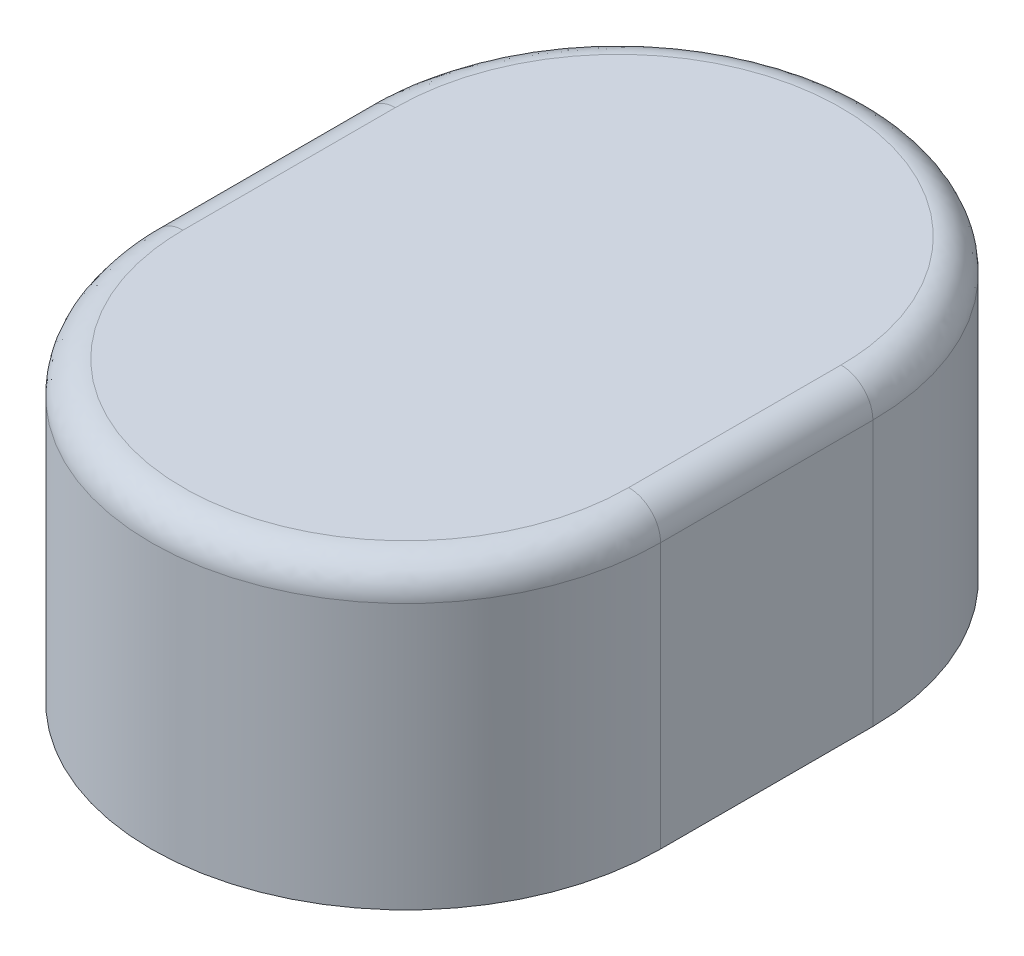
ISO-10303-21;
HEADER;
FILE_DESCRIPTION(('STEP AP214'),'2;1');
FILE_NAME('part.step','',(''),(''),'','','');
FILE_SCHEMA(('AUTOMOTIVE_DESIGN { 1 0 10303 214 1 1 1 1 }'));
ENDSEC;
DATA;
#1=APPLICATION_CONTEXT('core data for automotive mechanical design processes');
#2=APPLICATION_PROTOCOL_DEFINITION('international standard','automotive_design',2000,#1);
#3=PRODUCT_CONTEXT('',#1,'mechanical');
#4=PRODUCT('Part','Part','',(#3));
#5=PRODUCT_RELATED_PRODUCT_CATEGORY('part','',(#4));
#6=PRODUCT_DEFINITION_FORMATION('','',#4);
#7=PRODUCT_DEFINITION_CONTEXT('part definition',#1,'design');
#8=PRODUCT_DEFINITION('design','',#6,#7);
#9=PRODUCT_DEFINITION_SHAPE('','',#8);
#10=(LENGTH_UNIT() NAMED_UNIT(*) SI_UNIT(.MILLI.,.METRE.));
#11=(NAMED_UNIT(*) PLANE_ANGLE_UNIT() SI_UNIT($,.RADIAN.));
#12=(NAMED_UNIT(*) SI_UNIT($,.STERADIAN.) SOLID_ANGLE_UNIT());
#13=UNCERTAINTY_MEASURE_WITH_UNIT(LENGTH_MEASURE(1.E-05),#10,'distance_accuracy_value','');
#14=(GEOMETRIC_REPRESENTATION_CONTEXT(3) GLOBAL_UNCERTAINTY_ASSIGNED_CONTEXT((#13)) GLOBAL_UNIT_ASSIGNED_CONTEXT((#10,
#11,#12)) REPRESENTATION_CONTEXT('',''));
#15=CARTESIAN_POINT('',(0.,0.,0.));
#16=DIRECTION('',(0.,0.,1.));
#17=DIRECTION('',(1.,0.,0.));
#18=AXIS2_PLACEMENT_3D('',#15,#16,#17);
#19=CARTESIAN_POINT('',(-10.5,4.805,-0.25));
#20=DIRECTION('',(0.,-1.,0.));
#21=DIRECTION('',(0.,0.,-1.));
#22=AXIS2_PLACEMENT_3D('',#19,#20,#21);
#23=CYLINDRICAL_SURFACE('',#22,0.6);
#24=CARTESIAN_POINT('',(-10.5,4.73,-0.25));
#25=DIRECTION('',(0.,-1.,0.));
#26=DIRECTION('',(0.,0.,-1.));
#27=AXIS2_PLACEMENT_3D('',#24,#25,#26);
#28=CIRCLE('',#27,0.6);
#29=CARTESIAN_POINT('',(-11.1,4.73,-0.25));
#30=VERTEX_POINT('',#29);
#31=CARTESIAN_POINT('',(-10.5,4.73,-0.85));
#32=VERTEX_POINT('',#31);
#33=EDGE_CURVE('E11',#30,#32,#28,.T.);
#34=ORIENTED_EDGE('',*,*,#33,.T.);
#35=DIRECTION('',(0.,-1.,0.));
#36=VECTOR('',#35,1.);
#37=CARTESIAN_POINT('',(-10.5,4.805,-0.85));
#38=LINE('',#37,#36);
#39=CARTESIAN_POINT('',(-10.5,4.105,-0.85));
#40=VERTEX_POINT('',#39);
#41=EDGE_CURVE('E24',#32,#40,#38,.T.);
#42=ORIENTED_EDGE('',*,*,#41,.T.);
#43=CARTESIAN_POINT('',(-10.5,4.105,-0.25));
#44=DIRECTION('',(0.,1.,0.));
#45=DIRECTION('',(0.,0.,-1.));
#46=AXIS2_PLACEMENT_3D('',#43,#44,#45);
#47=CIRCLE('',#46,0.6);
#48=CARTESIAN_POINT('',(-11.1,4.105,-0.25));
#49=VERTEX_POINT('',#48);
#50=EDGE_CURVE('E214',#40,#49,#47,.T.);
#51=ORIENTED_EDGE('',*,*,#50,.T.);
#52=DIRECTION('',(0.,1.,0.));
#53=VECTOR('',#52,1.);
#54=CARTESIAN_POINT('',(-11.1,4.805,-0.25));
#55=LINE('',#54,#53);
#56=EDGE_CURVE('E212',#49,#30,#55,.T.);
#57=ORIENTED_EDGE('',*,*,#56,.T.);
#58=EDGE_LOOP('',(#34,#42,#51,#57));
#59=FACE_BOUND('',#58,.T.);
#60=ADVANCED_FACE('F17',(#59),#23,.T.);
#61=CARTESIAN_POINT('',(-10.5,4.105,-0.25));
#62=DIRECTION('',(0.,1.,0.));
#63=DIRECTION('',(1.,0.,0.));
#64=AXIS2_PLACEMENT_3D('',#61,#62,#63);
#65=PLANE('',#64);
#66=DIRECTION('',(0.,0.,-1.));
#67=VECTOR('',#66,1.);
#68=CARTESIAN_POINT('',(-9.9,4.105,-0.25));
#69=LINE('',#68,#67);
#70=CARTESIAN_POINT('',(-9.9,4.105,0.25));
#71=VERTEX_POINT('',#70);
#72=CARTESIAN_POINT('',(-9.9,4.105,-0.25));
#73=VERTEX_POINT('',#72);
#74=EDGE_CURVE('E210',#71,#73,#69,.T.);
#75=ORIENTED_EDGE('',*,*,#74,.F.);
#76=CARTESIAN_POINT('',(-10.5,4.105,0.25));
#77=DIRECTION('',(0.,1.,0.));
#78=DIRECTION('',(0.,0.,-1.));
#79=AXIS2_PLACEMENT_3D('',#76,#77,#78);
#80=CIRCLE('',#79,0.6);
#81=CARTESIAN_POINT('',(-11.1,4.105,0.25));
#82=VERTEX_POINT('',#81);
#83=EDGE_CURVE('E207',#82,#71,#80,.T.);
#84=ORIENTED_EDGE('',*,*,#83,.F.);
#85=DIRECTION('',(0.,0.,1.));
#86=VECTOR('',#85,1.);
#87=CARTESIAN_POINT('',(-11.1,4.105,-0.25));
#88=LINE('',#87,#86);
#89=EDGE_CURVE('E204',#49,#82,#88,.T.);
#90=ORIENTED_EDGE('',*,*,#89,.F.);
#91=ORIENTED_EDGE('',*,*,#50,.F.);
#92=CARTESIAN_POINT('',(-10.5,4.105,-0.25));
#93=DIRECTION('',(0.,1.,0.));
#94=DIRECTION('',(0.,0.,-1.));
#95=AXIS2_PLACEMENT_3D('',#92,#93,#94);
#96=CIRCLE('',#95,0.6);
#97=EDGE_CURVE('E201',#73,#40,#96,.T.);
#98=ORIENTED_EDGE('',*,*,#97,.F.);
#99=EDGE_LOOP('',(#75,#84,#90,#91,#98));
#100=FACE_BOUND('',#99,.T.);
#101=ADVANCED_FACE('F221',(#100),#65,.F.);
#102=CARTESIAN_POINT('',(-10.5,4.805,-0.25));
#103=DIRECTION('',(0.,-1.,0.));
#104=DIRECTION('',(0.,0.,-1.));
#105=AXIS2_PLACEMENT_3D('',#102,#103,#104);
#106=CYLINDRICAL_SURFACE('',#105,0.6);
#107=ORIENTED_EDGE('',*,*,#41,.F.);
#108=CARTESIAN_POINT('',(-10.5,4.73,-0.25));
#109=DIRECTION('',(0.,-1.,0.));
#110=DIRECTION('',(0.,0.,-1.));
#111=AXIS2_PLACEMENT_3D('',#108,#109,#110);
#112=CIRCLE('',#111,0.6);
#113=CARTESIAN_POINT('',(-9.9,4.73,-0.25));
#114=VERTEX_POINT('',#113);
#115=EDGE_CURVE('E199',#32,#114,#112,.T.);
#116=ORIENTED_EDGE('',*,*,#115,.T.);
#117=DIRECTION('',(0.,-1.,0.));
#118=VECTOR('',#117,1.);
#119=CARTESIAN_POINT('',(-9.9,4.805,-0.25));
#120=LINE('',#119,#118);
#121=EDGE_CURVE('E196',#114,#73,#120,.T.);
#122=ORIENTED_EDGE('',*,*,#121,.T.);
#123=ORIENTED_EDGE('',*,*,#97,.T.);
#124=EDGE_LOOP('',(#107,#116,#122,#123));
#125=FACE_BOUND('',#124,.T.);
#126=ADVANCED_FACE('F222',(#125),#106,.T.);
#127=CARTESIAN_POINT('',(-9.9,4.805,-0.25));
#128=DIRECTION('',(-1.,0.,0.));
#129=DIRECTION('',(0.,0.,1.));
#130=AXIS2_PLACEMENT_3D('',#127,#128,#129);
#131=PLANE('',#130);
#132=DIRECTION('',(0.,0.,-1.));
#133=VECTOR('',#132,1.);
#134=CARTESIAN_POINT('',(-9.9,4.73,-0.25));
#135=LINE('',#134,#133);
#136=CARTESIAN_POINT('',(-9.9,4.73,0.25));
#137=VERTEX_POINT('',#136);
#138=EDGE_CURVE('E191',#137,#114,#135,.T.);
#139=ORIENTED_EDGE('',*,*,#138,.F.);
#140=DIRECTION('',(0.,1.,0.));
#141=VECTOR('',#140,1.);
#142=CARTESIAN_POINT('',(-9.9,4.805,0.25));
#143=LINE('',#142,#141);
#144=EDGE_CURVE('E187',#71,#137,#143,.T.);
#145=ORIENTED_EDGE('',*,*,#144,.F.);
#146=ORIENTED_EDGE('',*,*,#74,.T.);
#147=ORIENTED_EDGE('',*,*,#121,.F.);
#148=EDGE_LOOP('',(#139,#145,#146,#147));
#149=FACE_BOUND('',#148,.T.);
#150=ADVANCED_FACE('F168',(#149),#131,.F.);
#151=CARTESIAN_POINT('',(-10.5,4.805,0.25));
#152=DIRECTION('',(0.,-1.,0.));
#153=DIRECTION('',(0.,0.,-1.));
#154=AXIS2_PLACEMENT_3D('',#151,#152,#153);
#155=CYLINDRICAL_SURFACE('',#154,0.6);
#156=DIRECTION('',(0.,-1.,0.));
#157=VECTOR('',#156,1.);
#158=CARTESIAN_POINT('',(-11.1,4.805,0.25));
#159=LINE('',#158,#157);
#160=CARTESIAN_POINT('',(-11.1,4.73,0.25));
#161=VERTEX_POINT('',#160);
#162=EDGE_CURVE('E185',#161,#82,#159,.T.);
#163=ORIENTED_EDGE('',*,*,#162,.T.);
#164=ORIENTED_EDGE('',*,*,#83,.T.);
#165=ORIENTED_EDGE('',*,*,#144,.T.);
#166=CARTESIAN_POINT('',(-11.1,4.73,0.25));
#167=CARTESIAN_POINT('',(-11.1000000036229,4.73,0.253563796691147));
#168=CARTESIAN_POINT('',(-11.0999682485152,4.73,0.257127593317989));
#169=CARTESIAN_POINT('',(-11.0998411944613,4.73,0.264256993446407));
#170=CARTESIAN_POINT('',(-11.0997458431378,4.73,0.267822596014641));
#171=CARTESIAN_POINT('',(-11.0994914883899,4.73,0.274953830624711));
#172=CARTESIAN_POINT('',(-11.09933244399,4.73,0.278519461205099));
#173=CARTESIAN_POINT('',(-11.0989506639144,4.73,0.285649014806997));
#174=CARTESIAN_POINT('',(-11.0987278979271,4.73,0.289212936205382));
#175=CARTESIAN_POINT('',(-11.0982186938193,4.73,0.296337379444931));
#176=CARTESIAN_POINT('',(-11.0979322352456,4.73,0.299897899824259));
#177=CARTESIAN_POINT('',(-11.0972957209903,4.73,0.307013898555132));
#178=CARTESIAN_POINT('',(-11.096945653851,4.73,0.3105693758818));
#179=CARTESIAN_POINT('',(-11.0961820482729,4.73,0.317673699660756));
#180=CARTESIAN_POINT('',(-11.0957685064556,4.73,0.321222545749913));
#181=CARTESIAN_POINT('',(-11.0948781233345,4.73,0.328312075557103));
#182=CARTESIAN_POINT('',(-11.0944012857678,4.73,0.331852759744481));
#183=CARTESIAN_POINT('',(-11.0933845195815,4.73,0.338924523905563));
#184=CARTESIAN_POINT('',(-11.0928446002907,4.73,0.342455605220544));
#185=CARTESIAN_POINT('',(-11.0917018930946,4.73,0.349506904163674));
#186=CARTESIAN_POINT('',(-11.0910991169428,4.73,0.353027123696535));
#187=CARTESIAN_POINT('',(-11.0898309307543,4.73,0.360055542061797));
#188=CARTESIAN_POINT('',(-11.0891655331544,4.73,0.363563743138273));
#189=CARTESIAN_POINT('',(-11.0877723475364,4.73,0.370567042952399));
#190=CARTESIAN_POINT('',(-11.0870445713813,4.73,0.374062144049985));
#191=CARTESIAN_POINT('',(-11.085526874175,4.73,0.381038238282816));
#192=CARTESIAN_POINT('',(-11.0847369631428,4.73,0.384519233597761));
#193=CARTESIAN_POINT('',(-11.0830952370233,4.73,0.391466186769767));
#194=CARTESIAN_POINT('',(-11.0822434288334,4.73,0.394932146256874));
#195=CARTESIAN_POINT('',(-11.0804781377996,4.73,0.401848173991111));
#196=CARTESIAN_POINT('',(-11.0795646574521,4.73,0.405298242875415));
#197=CARTESIAN_POINT('',(-11.0776762333187,4.73,0.412181710394185));
#198=CARTESIAN_POINT('',(-11.0767012863506,4.73,0.415615108155635));
#199=CARTESIAN_POINT('',(-11.0746901476351,4.73,0.422464417613972));
#200=CARTESIAN_POINT('',(-11.0736539477219,4.73,0.425880326913135));
#201=CARTESIAN_POINT('',(-11.0715206388389,4.73,0.432693467856374));
#202=CARTESIAN_POINT('',(-11.0704235234649,4.73,0.436090697495179));
#203=CARTESIAN_POINT('',(-11.0681687675635,4.73,0.442865229771746));
#204=CARTESIAN_POINT('',(-11.0670111235414,4.73,0.446242531246324));
#205=CARTESIAN_POINT('',(-11.0646357105223,4.73,0.452976009096735));
#206=CARTESIAN_POINT('',(-11.0634179401668,4.73,0.456332184993286));
#207=CARTESIAN_POINT('',(-11.0609226866552,4.73,0.463022265176901));
#208=CARTESIAN_POINT('',(-11.0596452034998,4.73,0.466356169464206));
#209=CARTESIAN_POINT('',(-11.0570309442756,4.73,0.473000611511513));
#210=CARTESIAN_POINT('',(-11.0556941687896,4.73,0.476311149500794));
#211=CARTESIAN_POINT('',(-11.0529617482405,4.73,0.482907815301674));
#212=CARTESIAN_POINT('',(-11.0515661035686,4.73,0.486193943275284));
#213=CARTESIAN_POINT('',(-11.0487163672123,4.73,0.492740796007829));
#214=CARTESIAN_POINT('',(-11.0472622749607,4.73,0.496001520519842));
#215=CARTESIAN_POINT('',(-11.0442960799491,4.73,0.502496581609415));
#216=CARTESIAN_POINT('',(-11.0427839756446,4.73,0.505730917481572));
#217=CARTESIAN_POINT('',(-11.0397022671294,4.73,0.512172098733919));
#218=CARTESIAN_POINT('',(-11.0381326626331,4.73,0.515378943977394));
#219=CARTESIAN_POINT('',(-11.0349364913788,4.73,0.521764045093686));
#220=CARTESIAN_POINT('',(-11.0333099257047,4.73,0.524942301509106));
#221=CARTESIAN_POINT('',(-11.0300003763664,4.73,0.531269170423583));
#222=CARTESIAN_POINT('',(-11.028317394552,4.73,0.534417783890275));
#223=CARTESIAN_POINT('',(-11.0248955604728,4.73,0.540684356053603));
#224=CARTESIAN_POINT('',(-11.0231567102287,4.73,0.543802315853617));
#225=CARTESIAN_POINT('',(-11.0196236868123,4.73,0.55000661263002));
#226=CARTESIAN_POINT('',(-11.017829515248,4.73,0.553092950522087));
#227=CARTESIAN_POINT('',(-11.0141863934983,4.73,0.559233077092693));
#228=CARTESIAN_POINT('',(-11.0123374439389,4.73,0.562286866142588));
#229=CARTESIAN_POINT('',(-11.0085853042002,4.73,0.568361008928823));
#230=CARTESIAN_POINT('',(-11.0066821131115,4.73,0.57138136210347));
#231=CARTESIAN_POINT('',(-11.0028220442131,4.73,0.577387746551132));
#232=CARTESIAN_POINT('',(-11.0008651641237,4.73,0.58037377635915));
#233=CARTESIAN_POINT('',(-10.9968983672244,4.73,0.586310508375131));
#234=CARTESIAN_POINT('',(-10.9948884490521,4.73,0.589261209672786));
#235=CARTESIAN_POINT('',(-10.9908162570123,4.73,0.595126277385909));
#236=CARTESIAN_POINT('',(-10.9887539829477,4.73,0.598040643664638));
#237=CARTESIAN_POINT('',(-10.984577765371,4.73,0.603832071088421));
#238=CARTESIAN_POINT('',(-10.9824638224004,4.73,0.606709132624063));
#239=CARTESIAN_POINT('',(-10.9781849560784,4.73,0.612425016479613));
#240=CARTESIAN_POINT('',(-10.976020033593,4.73,0.61526383944776));
#241=CARTESIAN_POINT('',(-10.9716398978163,4.73,0.620902347225699));
#242=CARTESIAN_POINT('',(-10.9694246853154,4.73,0.623702032649351));
#243=CARTESIAN_POINT('',(-10.9649446573833,4.73,0.629261400343731));
#244=CARTESIAN_POINT('',(-10.9626798422826,4.73,0.632021082880699));
#245=CARTESIAN_POINT('',(-10.9581012932316,4.73,0.637499612410369));
#246=CARTESIAN_POINT('',(-10.9557875587851,4.73,0.640218458988463));
#247=CARTESIAN_POINT('',(-10.9511118701503,4.73,0.645614491323857));
#248=CARTESIAN_POINT('',(-10.9487499147199,4.73,0.648291676004962));
#249=CARTESIAN_POINT('',(-10.9439785635254,4.73,0.653603494282183));
#250=CARTESIAN_POINT('',(-10.9415691671458,4.73,0.656238127325554));
#251=CARTESIAN_POINT('',(-10.9367037378312,4.73,0.6614639604688));
#252=CARTESIAN_POINT('',(-10.9342477050176,4.73,0.664055160681876));
#253=CARTESIAN_POINT('',(-10.9292898095954,4.73,0.669193278174117));
#254=CARTESIAN_POINT('',(-10.9267879475472,4.73,0.671740195994172));
#255=CARTESIAN_POINT('',(-10.9217392017195,4.73,0.676788929585677));
#256=CARTESIAN_POINT('',(-10.9191923186557,4.73,0.67929074607298));
#257=CARTESIAN_POINT('',(-10.9140543385846,4.73,0.684248487661005));
#258=CARTESIAN_POINT('',(-10.9114632421801,4.73,0.686704413386486));
#259=CARTESIAN_POINT('',(-10.9062376414666,4.73,0.691569612691581));
#260=CARTESIAN_POINT('',(-10.9036031373955,4.73,0.693978886526645));
#261=CARTESIAN_POINT('',(-10.8982915242784,4.73,0.698750048581179));
#262=CARTESIAN_POINT('',(-10.8956144148704,4.73,0.701111936397632));
#263=CARTESIAN_POINT('',(-10.8902184084302,4.73,0.705787602594082));
#264=CARTESIAN_POINT('',(-10.8874995105097,4.73,0.708101379948869));
#265=CARTESIAN_POINT('',(-10.8820208172863,4.73,0.71268006269039));
#266=CARTESIAN_POINT('',(-10.8792610215105,4.73,0.714944967511276));
#267=CARTESIAN_POINT('',(-10.8737014439286,4.73,0.719425154891965));
#268=CARTESIAN_POINT('',(-10.8709016621406,4.73,0.721640437474327));
#269=CARTESIAN_POINT('',(-10.8652630258377,4.73,0.726020658157341));
#270=CARTESIAN_POINT('',(-10.862424171634,4.73,0.728185596658858));
#271=CARTESIAN_POINT('',(-10.8567083046389,4.73,0.732464434085727));
#272=CARTESIAN_POINT('',(-10.8538312922677,4.73,0.734578333572729));
#273=CARTESIAN_POINT('',(-10.8480400228896,4.73,0.738754423997506));
#274=CARTESIAN_POINT('',(-10.8451257662421,4.73,0.740816615433825));
#275=CARTESIAN_POINT('',(-10.8392609211496,4.73,0.744888645849173));
#276=CARTESIAN_POINT('',(-10.8363103328478,4.73,0.746898485034446));
#277=CARTESIAN_POINT('',(-10.8303737353428,4.73,0.750865191003595));
#278=CARTESIAN_POINT('',(-10.8273877259261,4.73,0.75282205746799));
#279=CARTESIAN_POINT('',(-10.8213812095339,4.73,0.756682211161989));
#280=CARTESIAN_POINT('',(-10.8183607020364,4.73,0.758585497579637));
#281=CARTESIAN_POINT('',(-10.8122861719658,4.73,0.762337868942615));
#282=CARTESIAN_POINT('',(-10.8092321491243,4.73,0.764186953453449));
#283=CARTESIAN_POINT('',(-10.8030915873896,4.73,0.767830314668409));
#284=CARTESIAN_POINT('',(-10.8000050485193,4.73,0.769624591410838));
#285=CARTESIAN_POINT('',(-10.7938004549115,4.73,0.773157756011333));
#286=CARTESIAN_POINT('',(-10.7906824003658,4.73,0.774896644205908));
#287=CARTESIAN_POINT('',(-10.7844157760643,4.73,0.778318475067822));
#288=CARTESIAN_POINT('',(-10.7812672065588,4.73,0.780001418193255));
#289=CARTESIAN_POINT('',(-10.7749405528593,4.73,0.783310825864461));
#290=CARTESIAN_POINT('',(-10.7717624688756,4.73,0.784937290812147));
#291=CARTESIAN_POINT('',(-10.7653777860769,4.73,0.788133231804873));
#292=CARTESIAN_POINT('',(-10.7621711873457,4.73,0.789702708017616));
#293=CARTESIAN_POINT('',(-10.7557304737954,4.73,0.792784183074979));
#294=CARTESIAN_POINT('',(-10.7524963588594,4.73,0.794296181675666));
#295=CARTESIAN_POINT('',(-10.7460016216963,4.73,0.797262228754952));
#296=CARTESIAN_POINT('',(-10.7427409991834,4.73,0.798716276607959));
#297=CARTESIAN_POINT('',(-10.7361943011073,4.73,0.80156594997547));
#298=CARTESIAN_POINT('',(-10.7329082253956,4.73,0.802961575148763));
#299=CARTESIAN_POINT('',(-10.7263116875032,4.73,0.8056939491676));
#300=CARTESIAN_POINT('',(-10.7230012253282,4.73,0.807030698026729));
#301=CARTESIAN_POINT('',(-10.7163569817332,4.73,0.809644888653569));
#302=CARTESIAN_POINT('',(-10.7130232004058,4.73,0.81092233065694));
#303=CARTESIAN_POINT('',(-10.7063333859962,4.73,0.813417499394998));
#304=CARTESIAN_POINT('',(-10.702977353036,4.73,0.814635226456589));
#305=CARTESIAN_POINT('',(-10.6962441028017,4.73,0.817010579084523));
#306=CARTESIAN_POINT('',(-10.69286688563,4.73,0.818168204940753));
#307=CARTESIAN_POINT('',(-10.6860923341081,4.73,0.820422990254183));
#308=CARTESIAN_POINT('',(-10.6826949998005,4.73,0.821520149839205));
#309=CARTESIAN_POINT('',(-10.6758812806372,4.73,0.82365365841325));
#310=CARTESIAN_POINT('',(-10.6724648957329,4.73,0.824690007246824));
#311=CARTESIAN_POINT('',(-10.6656141490724,4.73,0.826701567962744));
#312=CARTESIAN_POINT('',(-10.6621797871936,4.73,0.827676779427311));
#313=CARTESIAN_POINT('',(-10.6552941908535,4.73,0.829565750582259));
#314=CARTESIAN_POINT('',(-10.651842956328,4.73,0.830479510038387));
#315=CARTESIAN_POINT('',(-10.6449247270411,4.73,0.832245282037421));
#316=CARTESIAN_POINT('',(-10.6414577322786,4.73,0.833097294575594));
#317=CARTESIAN_POINT('',(-10.6345090951434,4.73,0.834739299371787));
#318=CARTESIAN_POINT('',(-10.6310274528034,4.73,0.835529291767686));
#319=CARTESIAN_POINT('',(-10.6240506332546,4.73,0.837047004262989));
#320=CARTESIAN_POINT('',(-10.6205554560889,4.73,0.837774724560525));
#321=CARTESIAN_POINT('',(-10.6135526796213,4.73,0.839167661792467));
#322=CARTESIAN_POINT('',(-10.6100450803554,4.73,0.839832878907873));
#323=CARTESIAN_POINT('',(-10.6030185723227,4.73,0.841100599281079));
#324=CARTESIAN_POINT('',(-10.5994996635724,4.73000000000001,0.841703102630734));
#325=CARTESIAN_POINT('',(-10.5924516490544,4.73,0.842845205198397));
#326=CARTESIAN_POINT('',(-10.5889225432764,4.73,0.843384804352843));
#327=CARTESIAN_POINT('',(-10.5818552508802,4.73,0.84440092759674));
#328=CARTESIAN_POINT('',(-10.5783170642316,4.73,0.844877451476067));
#329=CARTESIAN_POINT('',(-10.5712327416797,4.73,0.84576727116452));
#330=CARTESIAN_POINT('',(-10.5676866057596,4.73,0.846180566840928));
#331=CARTESIAN_POINT('',(-10.5605875202104,4.73,0.846943797425688));
#332=CARTESIAN_POINT('',(-10.5570345705781,4.73,0.847293732303648));
#333=CARTESIAN_POINT('',(-10.5499229932143,4.73,0.847930129384024));
#334=CARTESIAN_POINT('',(-10.5463643654858,4.73,0.848216591620264));
#335=CARTESIAN_POINT('',(-10.5392425675638,4.73,0.848725952119343));
#336=CARTESIAN_POINT('',(-10.5356793973749,4.73,0.84894885044816));
#337=CARTESIAN_POINT('',(-10.5285496501662,4.73,0.849331012293411));
#338=CARTESIAN_POINT('',(-10.5249830731502,4.73,0.849490275882126));
#339=CARTESIAN_POINT('',(-10.5178476479097,4.73,0.849745117747283));
#340=CARTESIAN_POINT('',(-10.5142787996873,4.73,0.849840696082801));
#341=CARTESIAN_POINT('',(-10.5071399676429,4.73,0.849968137192753));
#342=CARTESIAN_POINT('',(-10.5035699838215,4.73,0.849999999999999));
#343=CARTESIAN_POINT('',(-10.4964300161785,4.73,0.849999999999999));
#344=CARTESIAN_POINT('',(-10.4928600323571,4.73,0.849968137192753));
#345=CARTESIAN_POINT('',(-10.4857212003127,4.73,0.849840696082801));
#346=CARTESIAN_POINT('',(-10.4821523520903,4.73,0.849745117747283));
#347=CARTESIAN_POINT('',(-10.4750169268498,4.73,0.849490275882127));
#348=CARTESIAN_POINT('',(-10.4714503498338,4.73,0.849331012293412));
#349=CARTESIAN_POINT('',(-10.4643206026251,4.73,0.84894885044816));
#350=CARTESIAN_POINT('',(-10.4607574324362,4.73,0.848725952119343));
#351=CARTESIAN_POINT('',(-10.4536356345142,4.73,0.848216591620264));
#352=CARTESIAN_POINT('',(-10.4500770067857,4.73,0.847930129384025));
#353=CARTESIAN_POINT('',(-10.4429654294219,4.73,0.847293732303649));
#354=CARTESIAN_POINT('',(-10.4394124797896,4.73,0.846943797425689));
#355=CARTESIAN_POINT('',(-10.4323133942404,4.73,0.846180566840928));
#356=CARTESIAN_POINT('',(-10.4287672583203,4.73,0.84576727116452));
#357=CARTESIAN_POINT('',(-10.4216829357684,4.73,0.844877451476067));
#358=CARTESIAN_POINT('',(-10.4181447491198,4.73,0.84440092759674));
#359=CARTESIAN_POINT('',(-10.4110774567236,4.73,0.843384804352843));
#360=CARTESIAN_POINT('',(-10.4075483509456,4.73,0.842845205198397));
#361=CARTESIAN_POINT('',(-10.4005003364276,4.73,0.841703102630735));
#362=CARTESIAN_POINT('',(-10.3969814276773,4.73,0.84110059928108));
#363=CARTESIAN_POINT('',(-10.3899549196446,4.73,0.839832878907874));
#364=CARTESIAN_POINT('',(-10.3864473203787,4.73,0.839167661792467));
#365=CARTESIAN_POINT('',(-10.3794445439111,4.73,0.837774724560525));
#366=CARTESIAN_POINT('',(-10.3759493667454,4.73,0.837047004262989));
#367=CARTESIAN_POINT('',(-10.3689725471966,4.73,0.835529291767686));
#368=CARTESIAN_POINT('',(-10.3654909048566,4.73000000000001,0.834739299371788));
#369=CARTESIAN_POINT('',(-10.3585422677214,4.73,0.833097294575594));
#370=CARTESIAN_POINT('',(-10.3550752729589,4.73,0.832245282037422));
#371=CARTESIAN_POINT('',(-10.348157043672,4.73,0.830479510038387));
#372=CARTESIAN_POINT('',(-10.3447058091465,4.73000000000001,0.829565750582259));
#373=CARTESIAN_POINT('',(-10.3378202128064,4.73000000000001,0.827676779427311));
#374=CARTESIAN_POINT('',(-10.3343858509276,4.73,0.826701567962745));
#375=CARTESIAN_POINT('',(-10.3275351042671,4.73,0.824690007246825));
#376=CARTESIAN_POINT('',(-10.3241187193628,4.73,0.82365365841325));
#377=CARTESIAN_POINT('',(-10.3173050001995,4.73,0.821520149839204));
#378=CARTESIAN_POINT('',(-10.3139076658919,4.73,0.820422990254183));
#379=CARTESIAN_POINT('',(-10.30713311437,4.73,0.818168204940754));
#380=CARTESIAN_POINT('',(-10.3037558971983,4.73,0.817010579084523));
#381=CARTESIAN_POINT('',(-10.297022646964,4.73,0.81463522645659));
#382=CARTESIAN_POINT('',(-10.2936666140038,4.73,0.813417499394999));
#383=CARTESIAN_POINT('',(-10.2869767995942,4.73,0.810922330656942));
#384=CARTESIAN_POINT('',(-10.2836430182668,4.73,0.809644888653571));
#385=CARTESIAN_POINT('',(-10.2769987746718,4.73,0.807030698026731));
#386=CARTESIAN_POINT('',(-10.2736883124968,4.73,0.805693949167602));
#387=CARTESIAN_POINT('',(-10.2670917746044,4.73,0.802961575148766));
#388=CARTESIAN_POINT('',(-10.2638056988927,4.73,0.801565949975472));
#389=CARTESIAN_POINT('',(-10.2572590008166,4.73,0.798716276607961));
#390=CARTESIAN_POINT('',(-10.2539983783037,4.73,0.797262228754954));
#391=CARTESIAN_POINT('',(-10.2475036411406,4.73,0.794296181675668));
#392=CARTESIAN_POINT('',(-10.2442695262046,4.73,0.792784183074982));
#393=CARTESIAN_POINT('',(-10.2378288126543,4.73,0.789702708017619));
#394=CARTESIAN_POINT('',(-10.2346222139231,4.73000000000001,0.788133231804875));
#395=CARTESIAN_POINT('',(-10.2282375311244,4.73000000000001,0.784937290812148));
#396=CARTESIAN_POINT('',(-10.2250594471407,4.73,0.783310825864463));
#397=CARTESIAN_POINT('',(-10.2187327934412,4.73,0.780001418193256));
#398=CARTESIAN_POINT('',(-10.2155842239357,4.73,0.778318475067821));
#399=CARTESIAN_POINT('',(-10.2093175996342,4.73,0.774896644205907));
#400=CARTESIAN_POINT('',(-10.2061995450885,4.73,0.773157756011333));
#401=CARTESIAN_POINT('',(-10.1999949514807,4.73,0.769624591410838));
#402=CARTESIAN_POINT('',(-10.1969084126104,4.73,0.767830314668407));
#403=CARTESIAN_POINT('',(-10.1907678508757,4.73,0.764186953453447));
#404=CARTESIAN_POINT('',(-10.1877138280341,4.73,0.762337868942613));
#405=CARTESIAN_POINT('',(-10.1816392979635,4.73,0.758585497579635));
#406=CARTESIAN_POINT('',(-10.1786187904661,4.73,0.756682211161986));
#407=CARTESIAN_POINT('',(-10.1726122740739,4.73,0.752822057467987));
#408=CARTESIAN_POINT('',(-10.1696262646572,4.73,0.750865191003592));
#409=CARTESIAN_POINT('',(-10.1636896671522,4.73,0.746898485034444));
#410=CARTESIAN_POINT('',(-10.1607390788504,4.73,0.74488864584917));
#411=CARTESIAN_POINT('',(-10.1548742337579,4.73,0.740816615433823));
#412=CARTESIAN_POINT('',(-10.1519599771104,4.73,0.738754423997503));
#413=CARTESIAN_POINT('',(-10.1461687077323,4.73,0.734578333572727));
#414=CARTESIAN_POINT('',(-10.1432916953611,4.73,0.732464434085725));
#415=CARTESIAN_POINT('',(-10.1375758283659,4.73,0.728185596658857));
#416=CARTESIAN_POINT('',(-10.1347369741623,4.73,0.72602065815734));
#417=CARTESIAN_POINT('',(-10.1290983378594,4.73,0.721640437474328));
#418=CARTESIAN_POINT('',(-10.1262985560714,4.73,0.719425154891966));
#419=CARTESIAN_POINT('',(-10.1207389784895,4.73,0.714944967511277));
#420=CARTESIAN_POINT('',(-10.1179791827137,4.73000000000001,0.712680062690391));
#421=CARTESIAN_POINT('',(-10.1125004894903,4.73000000000001,0.708101379948869));
#422=CARTESIAN_POINT('',(-10.1097815915698,4.73,0.705787602594084));
#423=CARTESIAN_POINT('',(-10.1043855851296,4.73,0.701111936397636));
#424=CARTESIAN_POINT('',(-10.1017084757216,4.73,0.698750048581183));
#425=CARTESIAN_POINT('',(-10.0963968626045,4.73,0.693978886526648));
#426=CARTESIAN_POINT('',(-10.0937623585334,4.73,0.691569612691583));
#427=CARTESIAN_POINT('',(-10.0885367578199,4.73,0.686704413386489));
#428=CARTESIAN_POINT('',(-10.0859456614154,4.73,0.684248487661008));
#429=CARTESIAN_POINT('',(-10.0808076813443,4.73,0.679290746072984));
#430=CARTESIAN_POINT('',(-10.0782607982805,4.73,0.67678892958568));
#431=CARTESIAN_POINT('',(-10.0732120524528,4.73,0.671740195994176));
#432=CARTESIAN_POINT('',(-10.0707101904046,4.73,0.66919327817412));
#433=CARTESIAN_POINT('',(-10.0657522949824,4.73,0.664055160681879));
#434=CARTESIAN_POINT('',(-10.0632962621688,4.73,0.661463960468803));
#435=CARTESIAN_POINT('',(-10.0584308328542,4.73,0.656238127325557));
#436=CARTESIAN_POINT('',(-10.0560214364746,4.73,0.653603494282187));
#437=CARTESIAN_POINT('',(-10.0512500852801,4.73,0.648291676004966));
#438=CARTESIAN_POINT('',(-10.0488881298497,4.73,0.645614491323861));
#439=CARTESIAN_POINT('',(-10.0442124412149,4.73,0.640218458988466));
#440=CARTESIAN_POINT('',(-10.0418987067684,4.73,0.637499612410372));
#441=CARTESIAN_POINT('',(-10.0373201577174,4.73,0.632021082880701));
#442=CARTESIAN_POINT('',(-10.0350553426167,4.73,0.629261400343734));
#443=CARTESIAN_POINT('',(-10.0305753146846,4.73,0.623702032649353));
#444=CARTESIAN_POINT('',(-10.0283601021837,4.73,0.620902347225701));
#445=CARTESIAN_POINT('',(-10.023979966407,4.73,0.615263839447761));
#446=CARTESIAN_POINT('',(-10.0218150439216,4.73,0.612425016479615));
#447=CARTESIAN_POINT('',(-10.0175361775996,4.73,0.606709132624065));
#448=CARTESIAN_POINT('',(-10.015422234629,4.73,0.603832071088423));
#449=CARTESIAN_POINT('',(-10.0112460170523,4.73,0.598040643664639));
#450=CARTESIAN_POINT('',(-10.0091837429878,4.73,0.595126277385909));
#451=CARTESIAN_POINT('',(-10.0051115509479,4.73,0.589261209672787));
#452=CARTESIAN_POINT('',(-10.0031016327756,4.73,0.586310508375132));
#453=CARTESIAN_POINT('',(-9.99913483587629,4.73,0.580373776359151));
#454=CARTESIAN_POINT('',(-9.99717795578695,4.73,0.577387746551133));
#455=CARTESIAN_POINT('',(-9.99331788688851,4.73,0.571381362103471));
#456=CARTESIAN_POINT('',(-9.99141469579984,4.73,0.568361008928825));
#457=CARTESIAN_POINT('',(-9.98766255606106,4.73,0.562286866142589));
#458=CARTESIAN_POINT('',(-9.98581360650165,4.73,0.559233077092695));
#459=CARTESIAN_POINT('',(-9.98217048475202,4.73,0.553092950522089));
#460=CARTESIAN_POINT('',(-9.98037631318768,4.73,0.550006612630022));
#461=CARTESIAN_POINT('',(-9.97684328977126,4.73,0.543802315853619));
#462=CARTESIAN_POINT('',(-9.9751044395272,4.73,0.540684356053605));
#463=CARTESIAN_POINT('',(-9.97168260544805,4.73,0.534417783890276));
#464=CARTESIAN_POINT('',(-9.96999962363362,4.73,0.531269170423584));
#465=CARTESIAN_POINT('',(-9.9666900742953,4.73,0.524942301509108));
#466=CARTESIAN_POINT('',(-9.96506350862123,4.73,0.52176404509369));
#467=CARTESIAN_POINT('',(-9.96186733736688,4.73,0.515378943977397));
#468=CARTESIAN_POINT('',(-9.96029773287058,4.73,0.512172098733922));
#469=CARTESIAN_POINT('',(-9.95721602435545,4.73,0.505730917481574));
#470=CARTESIAN_POINT('',(-9.95570392005086,4.73,0.502496581609417));
#471=CARTESIAN_POINT('',(-9.95273772503927,4.73,0.496001520519845));
#472=CARTESIAN_POINT('',(-9.95128363278765,4.73,0.492740796007833));
#473=CARTESIAN_POINT('',(-9.94843389643141,4.73,0.486193943275288));
#474=CARTESIAN_POINT('',(-9.94703825175951,4.73,0.482907815301677));
#475=CARTESIAN_POINT('',(-9.94430583121043,4.73,0.476311149500795));
#476=CARTESIAN_POINT('',(-9.94296905572436,4.73,0.473000611511515));
#477=CARTESIAN_POINT('',(-9.94035479650017,4.73,0.466356169464209));
#478=CARTESIAN_POINT('',(-9.93907731334479,4.73,0.463022265176903));
#479=CARTESIAN_POINT('',(-9.93658205983323,4.73,0.456332184993287));
#480=CARTESIAN_POINT('',(-9.9353642894777,4.73,0.452976009096736));
#481=CARTESIAN_POINT('',(-9.93298887645862,4.73,0.446242531246325));
#482=CARTESIAN_POINT('',(-9.93183123243647,4.73,0.442865229771748));
#483=CARTESIAN_POINT('',(-9.92957647653514,4.73,0.43609069749518));
#484=CARTESIAN_POINT('',(-9.9284793611611,4.73,0.432693467856375));
#485=CARTESIAN_POINT('',(-9.92634605227809,4.73,0.425880326913135));
#486=CARTESIAN_POINT('',(-9.92530985236487,4.73,0.422464417613973));
#487=CARTESIAN_POINT('',(-9.92329871364945,4.73,0.415615108155636));
#488=CARTESIAN_POINT('',(-9.92232376668133,4.73,0.412181710394186));
#489=CARTESIAN_POINT('',(-9.92043534254789,4.73,0.405298242875416));
#490=CARTESIAN_POINT('',(-9.91952186220036,4.73,0.401848173991112));
#491=CARTESIAN_POINT('',(-9.91775657116664,4.73,0.394932146256875));
#492=CARTESIAN_POINT('',(-9.91690476297676,4.73,0.391466186769766));
#493=CARTESIAN_POINT('',(-9.91526303685718,4.73,0.384519233597761));
#494=CARTESIAN_POINT('',(-9.914473125825,4.73,0.381038238282817));
#495=CARTESIAN_POINT('',(-9.91295542861871,4.73,0.374062144049986));
#496=CARTESIAN_POINT('',(-9.91222765246358,4.73,0.370567042952399));
#497=CARTESIAN_POINT('',(-9.91083446684561,4.73,0.363563743138273));
#498=CARTESIAN_POINT('',(-9.91016906924574,4.73,0.360055542061798));
#499=CARTESIAN_POINT('',(-9.9089008830572,4.73,0.353027123696536));
#500=CARTESIAN_POINT('',(-9.90829810690539,4.73,0.349506904163674));
#501=CARTESIAN_POINT('',(-9.90715539970934,4.73,0.342455605220544));
#502=CARTESIAN_POINT('',(-9.90661548041849,4.73,0.338924523905564));
#503=CARTESIAN_POINT('',(-9.90559871423216,4.73,0.331852759744482));
#504=CARTESIAN_POINT('',(-9.90512187666546,4.73,0.328312075557104));
#505=CARTESIAN_POINT('',(-9.9042314935444,4.73,0.321222545749914));
#506=CARTESIAN_POINT('',(-9.90381795172712,4.73,0.317673699660757));
#507=CARTESIAN_POINT('',(-9.903054346149,4.73,0.310569375881801));
#508=CARTESIAN_POINT('',(-9.90270427900972,4.73,0.307013898555133));
#509=CARTESIAN_POINT('',(-9.90206776475445,4.73,0.29989789982426));
#510=CARTESIAN_POINT('',(-9.90178130618069,4.73,0.296337379444932));
#511=CARTESIAN_POINT('',(-9.90127210207286,4.73,0.289212936205382));
#512=CARTESIAN_POINT('',(-9.90104933608562,4.73,0.285649014806998));
#513=CARTESIAN_POINT('',(-9.90066755600996,4.73,0.278519461205099));
#514=CARTESIAN_POINT('',(-9.90050851161014,4.73,0.274953830624711));
#515=CARTESIAN_POINT('',(-9.90025415686218,4.73,0.267822596014641));
#516=CARTESIAN_POINT('',(-9.90015880553872,4.73,0.264256993446407));
#517=CARTESIAN_POINT('',(-9.90003175148476,4.73,0.257127593317989));
#518=CARTESIAN_POINT('',(-9.89999999637708,4.73,0.253563796691147));
#519=CARTESIAN_POINT('',(-9.9,4.73,0.25));
#520=B_SPLINE_CURVE_WITH_KNOTS('',3,(#166,#167,#168,#169,#170,#171,#172,#173,#174,#175,#176,
#177,#178,#179,#180,#181,#182,#183,#184,#185,#186,#187,#188,#189,#190,#191,#192,#193,#194,#195,
#196,#197,#198,#199,#200,#201,#202,#203,#204,#205,#206,#207,#208,#209,#210,#211,#212,#213,#214,
#215,#216,#217,#218,#219,#220,#221,#222,#223,#224,#225,#226,#227,#228,#229,#230,#231,#232,#233,
#234,#235,#236,#237,#238,#239,#240,#241,#242,#243,#244,#245,#246,#247,#248,#249,#250,#251,#252,
#253,#254,#255,#256,#257,#258,#259,#260,#261,#262,#263,#264,#265,#266,#267,#268,#269,#270,#271,
#272,#273,#274,#275,#276,#277,#278,#279,#280,#281,#282,#283,#284,#285,#286,#287,#288,#289,#290,
#291,#292,#293,#294,#295,#296,#297,#298,#299,#300,#301,#302,#303,#304,#305,#306,#307,#308,#309,
#310,#311,#312,#313,#314,#315,#316,#317,#318,#319,#320,#321,#322,#323,#324,#325,#326,#327,#328,
#329,#330,#331,#332,#333,#334,#335,#336,#337,#338,#339,#340,#341,#342,#343,#344,#345,#346,#347,
#348,#349,#350,#351,#352,#353,#354,#355,#356,#357,#358,#359,#360,#361,#362,#363,#364,#365,#366,
#367,#368,#369,#370,#371,#372,#373,#374,#375,#376,#377,#378,#379,#380,#381,#382,#383,#384,#385,
#386,#387,#388,#389,#390,#391,#392,#393,#394,#395,#396,#397,#398,#399,#400,#401,#402,#403,#404,
#405,#406,#407,#408,#409,#410,#411,#412,#413,#414,#415,#416,#417,#418,#419,#420,#421,#422,#423,
#424,#425,#426,#427,#428,#429,#430,#431,#432,#433,#434,#435,#436,#437,#438,#439,#440,#441,#442,
#443,#444,#445,#446,#447,#448,#449,#450,#451,#452,#453,#454,#455,#456,#457,#458,#459,#460,#461,
#462,#463,#464,#465,#466,#467,#468,#469,#470,#471,#472,#473,#474,#475,#476,#477,#478,#479,#480,
#481,#482,#483,#484,#485,#486,#487,#488,#489,#490,#491,#492,#493,#494,#495,#496,#497,#498,#499,
#500,#501,#502,#503,#504,#505,#506,#507,#508,#509,#510,#511,#512,#513,#514,#515,#516,#517,#518,
#519),.UNSPECIFIED.,.F.,.F.,(4,2,2,2,2,2,2,2,2,2,2,2,2,2,2,2,2,2,2,2,2,2,2,2,2,2,2,2,2,2,2,2,2,
2,2,2,2,2,2,2,2,2,2,2,2,2,2,2,2,2,2,2,2,2,2,2,2,2,2,2,2,2,2,2,2,2,2,2,2,2,2,2,2,2,2,2,2,2,2,2,2,
2,2,2,2,2,2,2,2,2,2,2,2,2,2,2,2,2,2,2,2,2,2,2,2,2,2,2,2,2,2,2,2,2,2,2,2,2,2,2,2,2,2,2,2,2,2,2,2,
2,2,2,2,2,2,2,2,2,2,2,2,2,2,2,2,2,2,2,2,2,2,2,2,2,2,2,2,2,2,2,2,2,2,2,2,2,2,2,2,2,2,2,2,2,2,2,
4),(0.,0.0106912485747934,0.0213913132432996,0.0320982726127447,0.0428103336176236,
0.0535258394991103,0.064243277476717,0.0749612860875488,0.0856786621710596,0.0963944553298134,
0.107108248362703,0.117819918066,0.128529555156188,0.139237468889853,0.149944191208161,
0.160650480407987,0.171357324344271,0.182065598891826,0.192775001374159,0.203485022889078,
0.214195286515979,0.22490555002663,0.235615708297373,0.246325795421019,0.257035986517801,
0.267746462980029,0.278456992676198,0.289167318661168,0.299877293808494,0.310586882028713,
0.321296159248827,0.332005314153755,0.342714648691333,0.353424438642847,0.364134503961992,
0.374844609573657,0.38555460295747,0.39626441455086,0.406974057975685,0.41768363008974,
0.428393310864878,0.439103267830941,0.449813363807325,0.460523431865152,0.471233369011886,
0.481943136018973,0.492652757116149,0.503362319554242,0.514071973038419,0.524781854506706,
0.535491859908253,0.546201860440619,0.556911775665251,0.567621572980813,0.578331266997895,
0.589040918816997,0.599750635211971,0.610460513815373,0.621170478248238,0.631880435196013,
0.642590327063637,0.653300131213928,0.664009859134716,0.674719555536903,0.685429297385505,
0.696139154817215,0.706849074789854,0.717558992291197,0.728268867232447,0.738978683536759,
0.749688448179336,0.760398190181231,0.771107959559051,0.78181780211352,0.792527685491303,
0.803237569690304,0.813947430079441,0.824657256391838,0.835367051689299,0.846076831300131,
0.856786621732587,0.867496447841766,0.878206296430816,0.88891615015703,0.89962599817595,
0.91033583507825,0.921045659815693,0.9317554746185,0.942465283906134,0.953175093193766,
0.963884907996571,0.974594732734017,0.985304569636312,0.996014417655236,1.00672427138145,
1.0174341199705,1.02814394607967,1.03885373651212,1.04956351612296,1.06027331142043,
1.07098313773283,1.08169299812196,1.09240288232097,1.10311276569875,1.11382260825322,
1.12453237763104,1.13524211963293,1.1459518842755,1.15666170057982,1.16737157552107,
1.17808149302241,1.18879141299505,1.19950127042676,1.21021101227536,1.22092070867754,
1.23163043659834,1.24234024074863,1.25305013261626,1.26376008956403,1.2744700539969,
1.2851799326003,1.29588964899528,1.30659930081438,1.31730899483146,1.32801879214702,
1.33872870737165,1.34943870790402,1.36014871330556,1.37085859477384,1.38156824825802,
1.39227781069611,1.40298743179329,1.41369719880038,1.42440713594711,1.43511720400494,
1.44582729998132,1.45653725694739,1.46724693772252,1.47795650983658,1.4886661532614,
1.4993759648548,1.51008595823861,1.52079606385027,1.53150612916942,1.54221591912093,
1.55292525365851,1.56363440856344,1.57434368578355,1.58505327400377,1.59576324915109,
1.60647357513607,1.61718410483224,1.62789458129446,1.63860477239125,1.64931485951489,
1.66002501778564,1.67073528129628,1.68144554492318,1.6921555664381,1.70286496892044,
1.71357324346799,1.72428008740428,1.7349863766041,1.74569309892241,1.75640101265608,
1.76711064974626,1.77782231944956,1.78853611248245,1.79925190564121,1.80996928172472,
1.82068729033555,1.83140472831315,1.84212023419464,1.85283229519952,1.86353925456897,
1.87423931923747,1.88493056781227),.UNSPECIFIED.);
#521=EDGE_CURVE('E123',#137,#161,#520,.F.);
#522=ORIENTED_EDGE('',*,*,#521,.T.);
#523=EDGE_LOOP('',(#163,#164,#165,#522));
#524=FACE_BOUND('',#523,.T.);
#525=ADVANCED_FACE('F163',(#524),#155,.T.);
#526=CARTESIAN_POINT('',(-11.1,4.805,-0.25));
#527=DIRECTION('',(1.,0.,0.));
#528=DIRECTION('',(0.,1.,0.));
#529=AXIS2_PLACEMENT_3D('',#526,#527,#528);
#530=PLANE('',#529);
#531=DIRECTION('',(0.,0.,1.));
#532=VECTOR('',#531,1.);
#533=CARTESIAN_POINT('',(-11.1,4.73,-0.25));
#534=LINE('',#533,#532);
#535=EDGE_CURVE('E91',#30,#161,#534,.T.);
#536=ORIENTED_EDGE('',*,*,#535,.F.);
#537=ORIENTED_EDGE('',*,*,#56,.F.);
#538=ORIENTED_EDGE('',*,*,#89,.T.);
#539=ORIENTED_EDGE('',*,*,#162,.F.);
#540=EDGE_LOOP('',(#536,#537,#538,#539));
#541=FACE_BOUND('',#540,.T.);
#542=ADVANCED_FACE('F155',(#541),#530,.F.);
#543=CARTESIAN_POINT('',(-9.975,4.805,-0.25));
#544=CARTESIAN_POINT('',(-9.97499999999999,4.80500000000001,-1.3));
#545=CARTESIAN_POINT('',(-11.025,4.80500000000001,-1.3));
#546=CARTESIAN_POINT('',(-11.025,4.805,-0.25));
#547=CARTESIAN_POINT('',(-9.93106601717799,4.805,-0.25));
#548=CARTESIAN_POINT('',(-9.93106601717798,4.805,-1.38786796564404));
#549=CARTESIAN_POINT('',(-11.068933982822,4.805,-1.38786796564404));
#550=CARTESIAN_POINT('',(-11.068933982822,4.805,-0.25));
#551=CARTESIAN_POINT('',(-9.90000000000001,4.77393398282202,-0.25));
#552=CARTESIAN_POINT('',(-9.90000000000001,4.77393398282202,-1.45));
#553=CARTESIAN_POINT('',(-11.1,4.77393398282202,-1.45));
#554=CARTESIAN_POINT('',(-11.1,4.77393398282202,-0.25));
#555=CARTESIAN_POINT('',(-9.9,4.73,-0.25));
#556=CARTESIAN_POINT('',(-9.89999999999999,4.73000000000001,-1.45));
#557=CARTESIAN_POINT('',(-11.1,4.73000000000001,-1.45));
#558=CARTESIAN_POINT('',(-11.1,4.73,-0.25));
#559=(BOUNDED_SURFACE() B_SPLINE_SURFACE(3,3,((#543,#544,#545,#546),(#547,#548,#549,#550),(#551,
#552,#553,#554),(#555,#556,#557,#558)),.UNSPECIFIED.,.F.,.F.,
.F.) B_SPLINE_SURFACE_WITH_KNOTS((4,4),(4,4),(0.,1.),(0.,1.),
.UNSPECIFIED.) GEOMETRIC_REPRESENTATION_ITEM() RATIONAL_B_SPLINE_SURFACE(((1.,0.333333333333334,
0.333333333333334,1.),(0.80473785412436,0.268245951374786,0.268245951374786,0.80473785412436),
(0.80473785412436,0.268245951374786,0.268245951374786,0.80473785412436),(1.,0.333333333333334,
0.333333333333334,1.))) REPRESENTATION_ITEM('') SURFACE());
#560=CARTESIAN_POINT('',(-11.025,4.73,-0.25));
#561=DIRECTION('',(0.,0.,-1.));
#562=DIRECTION('',(-1.,0.,0.));
#563=AXIS2_PLACEMENT_3D('',#560,#561,#562);
#564=CIRCLE('',#563,0.0750000000000004);
#565=CARTESIAN_POINT('',(-11.025,4.805,-0.25));
#566=VERTEX_POINT('',#565);
#567=EDGE_CURVE('E115',#30,#566,#564,.T.);
#568=CARTESIAN_POINT('',(-11.025,4.805,-0.25));
#569=CARTESIAN_POINT('',(-11.025,4.80499999999999,-1.3));
#570=CARTESIAN_POINT('',(-9.97499999999999,4.80499999999999,-1.3));
#571=CARTESIAN_POINT('',(-9.975,4.805,-0.25));
#572=(BOUNDED_CURVE() B_SPLINE_CURVE(3,(#568,#569,#570,#571),.UNSPECIFIED.,.F.,
.F.) B_SPLINE_CURVE_WITH_KNOTS((4,4),(0.,1.),
.UNSPECIFIED.) CURVE() GEOMETRIC_REPRESENTATION_ITEM() RATIONAL_B_SPLINE_CURVE((1.,
0.333333333333334,0.333333333333334,1.)) REPRESENTATION_ITEM(''));
#573=CARTESIAN_POINT('',(-9.975,4.805,-0.25));
#574=VERTEX_POINT('',#573);
#575=EDGE_CURVE('E95',#566,#574,#572,.T.);
#576=CARTESIAN_POINT('',(-9.975,4.73,-0.25));
#577=DIRECTION('',(0.,0.,-1.));
#578=DIRECTION('',(1.,0.,0.));
#579=AXIS2_PLACEMENT_3D('',#576,#577,#578);
#580=CIRCLE('',#579,0.0750000000000004);
#581=EDGE_CURVE('E109',#574,#114,#580,.T.);
#582=ORIENTED_EDGE('',*,*,#567,.T.);
#583=ORIENTED_EDGE('',*,*,#575,.T.);
#584=ORIENTED_EDGE('',*,*,#581,.T.);
#585=ORIENTED_EDGE('',*,*,#115,.F.);
#586=ORIENTED_EDGE('',*,*,#33,.F.);
#587=EDGE_LOOP('',(#582,#583,#584,#585,#586));
#588=FACE_BOUND('',#587,.T.);
#589=ADVANCED_FACE('F149',(#588),#559,.T.);
#590=CARTESIAN_POINT('',(-9.975,4.73,-0.25));
#591=DIRECTION('',(0.,0.,1.));
#592=DIRECTION('',(1.,0.,0.));
#593=AXIS2_PLACEMENT_3D('',#590,#591,#592);
#594=CYLINDRICAL_SURFACE('',#593,0.0750000000000004);
#595=CARTESIAN_POINT('',(-9.975,4.73,0.25));
#596=DIRECTION('',(0.,0.,-1.));
#597=DIRECTION('',(1.,0.,0.));
#598=AXIS2_PLACEMENT_3D('',#595,#596,#597);
#599=CIRCLE('',#598,0.0750000000000004);
#600=CARTESIAN_POINT('',(-9.975,4.805,0.25));
#601=VERTEX_POINT('',#600);
#602=EDGE_CURVE('E77',#601,#137,#599,.T.);
#603=ORIENTED_EDGE('',*,*,#602,.T.);
#604=ORIENTED_EDGE('',*,*,#138,.T.);
#605=ORIENTED_EDGE('',*,*,#581,.F.);
#606=DIRECTION('',(0.,0.,1.));
#607=VECTOR('',#606,1.);
#608=CARTESIAN_POINT('',(-9.975,4.805,-0.25));
#609=LINE('',#608,#607);
#610=EDGE_CURVE('E82',#574,#601,#609,.T.);
#611=ORIENTED_EDGE('',*,*,#610,.T.);
#612=EDGE_LOOP('',(#603,#604,#605,#611));
#613=FACE_BOUND('',#612,.T.);
#614=ADVANCED_FACE('F140',(#613),#594,.T.);
#615=CARTESIAN_POINT('',(-11.025,4.805,0.25));
#616=CARTESIAN_POINT('',(-11.025,4.80500000000001,1.3));
#617=CARTESIAN_POINT('',(-9.97499999999999,4.80500000000001,1.3));
#618=CARTESIAN_POINT('',(-9.975,4.805,0.25));
#619=CARTESIAN_POINT('',(-11.068933982822,4.805,0.25));
#620=CARTESIAN_POINT('',(-11.068933982822,4.80500000000001,1.38786796564403));
#621=CARTESIAN_POINT('',(-9.93106601717798,4.80500000000001,1.38786796564403));
#622=CARTESIAN_POINT('',(-9.93106601717799,4.805,0.25));
#623=CARTESIAN_POINT('',(-11.1,4.77393398282202,0.25));
#624=CARTESIAN_POINT('',(-11.1,4.77393398282201,1.45));
#625=CARTESIAN_POINT('',(-9.89999999999999,4.77393398282201,1.45));
#626=CARTESIAN_POINT('',(-9.90000000000001,4.77393398282202,0.25));
#627=CARTESIAN_POINT('',(-11.1,4.73,0.25));
#628=CARTESIAN_POINT('',(-11.1,4.73000000000001,1.45));
#629=CARTESIAN_POINT('',(-9.89999999999999,4.73000000000001,1.45));
#630=CARTESIAN_POINT('',(-9.9,4.73,0.25));
#631=(BOUNDED_SURFACE() B_SPLINE_SURFACE(3,3,((#615,#616,#617,#618),(#619,#620,#621,#622),(#623,
#624,#625,#626),(#627,#628,#629,#630)),.UNSPECIFIED.,.F.,.F.,
.F.) B_SPLINE_SURFACE_WITH_KNOTS((4,4),(4,4),(0.,1.),(0.,1.),
.UNSPECIFIED.) GEOMETRIC_REPRESENTATION_ITEM() RATIONAL_B_SPLINE_SURFACE(((1.,0.333333333333334,
0.333333333333334,1.),(0.804737854124365,0.268245951374788,0.268245951374788,0.804737854124365),
(0.804737854124365,0.268245951374788,0.268245951374788,0.804737854124365),(1.,0.333333333333334,
0.333333333333334,1.))) REPRESENTATION_ITEM('') SURFACE());
#632=CARTESIAN_POINT('',(-9.975,4.805,0.25));
#633=CARTESIAN_POINT('',(-9.97499999999999,4.80499999999999,1.3));
#634=CARTESIAN_POINT('',(-11.025,4.80499999999999,1.3));
#635=CARTESIAN_POINT('',(-11.025,4.805,0.25));
#636=(BOUNDED_CURVE() B_SPLINE_CURVE(3,(#632,#633,#634,#635),.UNSPECIFIED.,.F.,
.F.) B_SPLINE_CURVE_WITH_KNOTS((4,4),(0.,1.),
.UNSPECIFIED.) CURVE() GEOMETRIC_REPRESENTATION_ITEM() RATIONAL_B_SPLINE_CURVE((1.,
0.333333333333334,0.333333333333334,1.)) REPRESENTATION_ITEM(''));
#637=CARTESIAN_POINT('',(-11.025,4.805,0.25));
#638=VERTEX_POINT('',#637);
#639=EDGE_CURVE('E71',#601,#638,#636,.T.);
#640=CARTESIAN_POINT('',(-11.025,4.73,0.25));
#641=DIRECTION('',(0.,0.,1.));
#642=DIRECTION('',(-1.,0.,0.));
#643=AXIS2_PLACEMENT_3D('',#640,#641,#642);
#644=CIRCLE('',#643,0.0750000000000004);
#645=EDGE_CURVE('E75',#638,#161,#644,.T.);
#646=ORIENTED_EDGE('',*,*,#602,.F.);
#647=ORIENTED_EDGE('',*,*,#639,.T.);
#648=ORIENTED_EDGE('',*,*,#645,.T.);
#649=ORIENTED_EDGE('',*,*,#521,.F.);
#650=EDGE_LOOP('',(#646,#647,#648,#649));
#651=FACE_BOUND('',#650,.T.);
#652=ADVANCED_FACE('F73',(#651),#631,.T.);
#653=CARTESIAN_POINT('',(-11.025,4.73,-0.25));
#654=DIRECTION('',(0.,0.,-1.));
#655=DIRECTION('',(-1.,0.,0.));
#656=AXIS2_PLACEMENT_3D('',#653,#654,#655);
#657=CYLINDRICAL_SURFACE('',#656,0.0750000000000004);
#658=ORIENTED_EDGE('',*,*,#645,.F.);
#659=DIRECTION('',(0.,0.,-1.));
#660=VECTOR('',#659,1.);
#661=CARTESIAN_POINT('',(-11.025,4.805,-0.25));
#662=LINE('',#661,#660);
#663=EDGE_CURVE('E89',#638,#566,#662,.T.);
#664=ORIENTED_EDGE('',*,*,#663,.T.);
#665=ORIENTED_EDGE('',*,*,#567,.F.);
#666=ORIENTED_EDGE('',*,*,#535,.T.);
#667=EDGE_LOOP('',(#658,#664,#665,#666));
#668=FACE_BOUND('',#667,.T.);
#669=ADVANCED_FACE('F87',(#668),#657,.T.);
#670=CARTESIAN_POINT('',(-10.5,4.805,-0.25));
#671=DIRECTION('',(0.,1.,0.));
#672=DIRECTION('',(1.,0.,0.));
#673=AXIS2_PLACEMENT_3D('',#670,#671,#672);
#674=PLANE('',#673);
#675=ORIENTED_EDGE('',*,*,#610,.F.);
#676=ORIENTED_EDGE('',*,*,#575,.F.);
#677=ORIENTED_EDGE('',*,*,#663,.F.);
#678=ORIENTED_EDGE('',*,*,#639,.F.);
#679=EDGE_LOOP('',(#675,#676,#677,#678));
#680=FACE_BOUND('',#679,.T.);
#681=ADVANCED_FACE('F94',(#680),#674,.T.);
#682=CLOSED_SHELL('',(#60,#101,#126,#150,#525,#542,#589,#614,#652,#669,#681));
#683=MANIFOLD_SOLID_BREP('B1',#682);
#684=ADVANCED_BREP_SHAPE_REPRESENTATION('',(#18,#683),#14);
#685=SHAPE_DEFINITION_REPRESENTATION(#9,#684);
ENDSEC;
END-ISO-10303-21;
